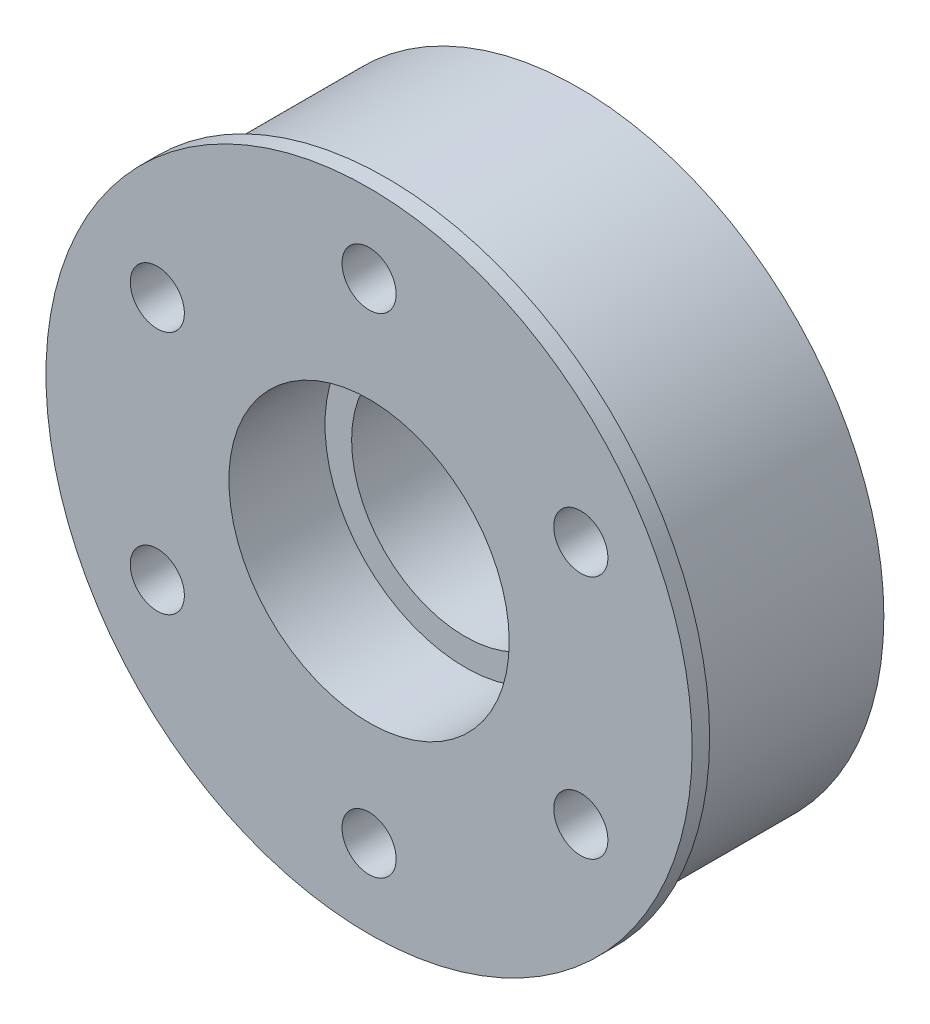
ISO-10303-21;
HEADER;
FILE_DESCRIPTION(('STEP AP214'),'2;1');
FILE_NAME('part.step','',(''),(''),'','','');
FILE_SCHEMA(('AUTOMOTIVE_DESIGN { 1 0 10303 214 1 1 1 1 }'));
ENDSEC;
DATA;
#1=APPLICATION_CONTEXT('core data for automotive mechanical design processes');
#2=APPLICATION_PROTOCOL_DEFINITION('international standard','automotive_design',2000,#1);
#3=PRODUCT_CONTEXT('',#1,'mechanical');
#4=PRODUCT('Part','Part','',(#3));
#5=PRODUCT_RELATED_PRODUCT_CATEGORY('part','',(#4));
#6=PRODUCT_DEFINITION_FORMATION('','',#4);
#7=PRODUCT_DEFINITION_CONTEXT('part definition',#1,'design');
#8=PRODUCT_DEFINITION('design','',#6,#7);
#9=PRODUCT_DEFINITION_SHAPE('','',#8);
#10=(LENGTH_UNIT() NAMED_UNIT(*) SI_UNIT(.MILLI.,.METRE.));
#11=(NAMED_UNIT(*) PLANE_ANGLE_UNIT() SI_UNIT($,.RADIAN.));
#12=(NAMED_UNIT(*) SI_UNIT($,.STERADIAN.) SOLID_ANGLE_UNIT());
#13=UNCERTAINTY_MEASURE_WITH_UNIT(LENGTH_MEASURE(1.E-05),#10,'distance_accuracy_value','');
#14=(GEOMETRIC_REPRESENTATION_CONTEXT(3) GLOBAL_UNCERTAINTY_ASSIGNED_CONTEXT((#13)) GLOBAL_UNIT_ASSIGNED_CONTEXT((#10,
#11,#12)) REPRESENTATION_CONTEXT('',''));
#15=CARTESIAN_POINT('',(0.,0.,0.));
#16=DIRECTION('',(0.,0.,1.));
#17=DIRECTION('',(1.,0.,0.));
#18=AXIS2_PLACEMENT_3D('',#15,#16,#17);
#19=CARTESIAN_POINT('',(0.,0.,34.6981276760882));
#20=DIRECTION('',(0.,0.,-1.));
#21=DIRECTION('',(-1.,0.,0.));
#22=AXIS2_PLACEMENT_3D('',#19,#20,#21);
#23=CYLINDRICAL_SURFACE('',#22,6.5);
#24=CARTESIAN_POINT('',(0.,0.,0.));
#25=DIRECTION('',(0.,0.,-1.));
#26=DIRECTION('',(-1.,0.,0.));
#27=AXIS2_PLACEMENT_3D('',#24,#25,#26);
#28=CIRCLE('',#27,6.5);
#29=CARTESIAN_POINT('',(-6.5,0.,0.));
#30=VERTEX_POINT('',#29);
#31=EDGE_CURVE('E149',#30,#30,#28,.T.);
#32=ORIENTED_EDGE('',*,*,#31,.T.);
#33=EDGE_LOOP('',(#32));
#34=FACE_BOUND('',#33,.T.);
#35=CARTESIAN_POINT('',(0.,0.,6.5));
#36=DIRECTION('',(0.,0.,1.));
#37=DIRECTION('',(1.,0.,0.));
#38=AXIS2_PLACEMENT_3D('',#35,#36,#37);
#39=CIRCLE('',#38,6.5);
#40=CARTESIAN_POINT('',(6.5,0.,6.5));
#41=VERTEX_POINT('',#40);
#42=EDGE_CURVE('E140',#41,#41,#39,.T.);
#43=ORIENTED_EDGE('',*,*,#42,.T.);
#44=EDGE_LOOP('',(#43));
#45=FACE_BOUND('',#44,.T.);
#46=ADVANCED_FACE('F53',(#34,#45),#23,.F.);
#47=CARTESIAN_POINT('',(0.,0.,12.));
#48=DIRECTION('',(0.,0.,-1.));
#49=DIRECTION('',(-1.,0.,0.));
#50=AXIS2_PLACEMENT_3D('',#47,#48,#49);
#51=CYLINDRICAL_SURFACE('',#50,17.475);
#52=CARTESIAN_POINT('',(0.,0.,0.));
#53=DIRECTION('',(0.,0.,1.));
#54=DIRECTION('',(1.,0.,0.));
#55=AXIS2_PLACEMENT_3D('',#52,#53,#54);
#56=CIRCLE('',#55,17.475);
#57=CARTESIAN_POINT('',(17.475,0.,0.));
#58=VERTEX_POINT('',#57);
#59=EDGE_CURVE('E62',#58,#58,#56,.T.);
#60=ORIENTED_EDGE('',*,*,#59,.T.);
#61=EDGE_LOOP('',(#60));
#62=FACE_BOUND('',#61,.T.);
#63=CARTESIAN_POINT('',(0.,0.,11.));
#64=DIRECTION('',(0.,0.,1.));
#65=DIRECTION('',(1.,0.,0.));
#66=AXIS2_PLACEMENT_3D('',#63,#64,#65);
#67=CIRCLE('',#66,17.475);
#68=CARTESIAN_POINT('',(17.475,0.,11.));
#69=VERTEX_POINT('',#68);
#70=EDGE_CURVE('E12',#69,#69,#67,.T.);
#71=ORIENTED_EDGE('',*,*,#70,.F.);
#72=EDGE_LOOP('',(#71));
#73=FACE_BOUND('',#72,.T.);
#74=ADVANCED_FACE('F55',(#62,#73),#51,.T.);
#75=CARTESIAN_POINT('',(0.,0.,12.));
#76=DIRECTION('',(0.,0.,1.));
#77=DIRECTION('',(1.,0.,0.));
#78=AXIS2_PLACEMENT_3D('',#75,#76,#77);
#79=PLANE('',#78);
#80=CARTESIAN_POINT('',(0.,0.,12.));
#81=DIRECTION('',(0.,0.,1.));
#82=DIRECTION('',(1.,0.,0.));
#83=AXIS2_PLACEMENT_3D('',#80,#81,#82);
#84=CIRCLE('',#83,8.025);
#85=CARTESIAN_POINT('',(8.025,0.,12.));
#86=VERTEX_POINT('',#85);
#87=EDGE_CURVE('E144',#86,#86,#84,.T.);
#88=ORIENTED_EDGE('',*,*,#87,.F.);
#89=EDGE_LOOP('',(#88));
#90=FACE_BOUND('',#89,.T.);
#91=CARTESIAN_POINT('',(-12.1243556529805,-7.00000000000096,12.));
#92=DIRECTION('',(0.,0.,1.));
#93=DIRECTION('',(1.,0.,0.));
#94=AXIS2_PLACEMENT_3D('',#91,#92,#93);
#95=CIRCLE('',#94,1.55);
#96=CARTESIAN_POINT('',(-10.5743556529805,-7.00000000000096,12.));
#97=VERTEX_POINT('',#96);
#98=EDGE_CURVE('E161',#97,#97,#95,.T.);
#99=ORIENTED_EDGE('',*,*,#98,.F.);
#100=EDGE_LOOP('',(#99));
#101=FACE_BOUND('',#100,.T.);
#102=CARTESIAN_POINT('',(2.21223967773475E-12,-14.,12.));
#103=DIRECTION('',(0.,0.,1.));
#104=DIRECTION('',(1.,0.,0.));
#105=AXIS2_PLACEMENT_3D('',#102,#103,#104);
#106=CIRCLE('',#105,1.55);
#107=CARTESIAN_POINT('',(1.55000000000221,-14.,12.));
#108=VERTEX_POINT('',#107);
#109=EDGE_CURVE('E194',#108,#108,#106,.T.);
#110=ORIENTED_EDGE('',*,*,#109,.F.);
#111=EDGE_LOOP('',(#110));
#112=FACE_BOUND('',#111,.T.);
#113=CARTESIAN_POINT('',(12.1243556529838,-6.99999999999904,12.));
#114=DIRECTION('',(0.,0.,1.));
#115=DIRECTION('',(1.,0.,0.));
#116=AXIS2_PLACEMENT_3D('',#113,#114,#115);
#117=CIRCLE('',#116,1.55);
#118=CARTESIAN_POINT('',(13.6743556529838,-6.99999999999904,12.));
#119=VERTEX_POINT('',#118);
#120=EDGE_CURVE('E186',#119,#119,#117,.T.);
#121=ORIENTED_EDGE('',*,*,#120,.F.);
#122=EDGE_LOOP('',(#121));
#123=FACE_BOUND('',#122,.T.);
#124=CARTESIAN_POINT('',(12.1243556529827,7.00000000000096,12.));
#125=DIRECTION('',(0.,0.,1.));
#126=DIRECTION('',(1.,0.,0.));
#127=AXIS2_PLACEMENT_3D('',#124,#125,#126);
#128=CIRCLE('',#127,1.55);
#129=CARTESIAN_POINT('',(13.6743556529827,7.00000000000096,12.));
#130=VERTEX_POINT('',#129);
#131=EDGE_CURVE('E178',#130,#130,#128,.T.);
#132=ORIENTED_EDGE('',*,*,#131,.F.);
#133=EDGE_LOOP('',(#132));
#134=FACE_BOUND('',#133,.T.);
#135=CARTESIAN_POINT('',(0.,14.,12.));
#136=DIRECTION('',(0.,0.,1.));
#137=DIRECTION('',(1.,0.,0.));
#138=AXIS2_PLACEMENT_3D('',#135,#136,#137);
#139=CIRCLE('',#138,1.55);
#140=CARTESIAN_POINT('',(1.55,14.,12.));
#141=VERTEX_POINT('',#140);
#142=EDGE_CURVE('E170',#141,#141,#139,.T.);
#143=ORIENTED_EDGE('',*,*,#142,.F.);
#144=EDGE_LOOP('',(#143));
#145=FACE_BOUND('',#144,.T.);
#146=CARTESIAN_POINT('',(-12.1243556529816,6.99999999999903,12.));
#147=DIRECTION('',(0.,0.,1.));
#148=DIRECTION('',(1.,0.,0.));
#149=AXIS2_PLACEMENT_3D('',#146,#147,#148);
#150=CIRCLE('',#149,1.55);
#151=CARTESIAN_POINT('',(-10.5743556529816,6.99999999999903,12.));
#152=VERTEX_POINT('',#151);
#153=EDGE_CURVE('E169',#152,#152,#150,.T.);
#154=ORIENTED_EDGE('',*,*,#153,.F.);
#155=EDGE_LOOP('',(#154));
#156=FACE_BOUND('',#155,.T.);
#157=CARTESIAN_POINT('',(0.,0.,12.));
#158=DIRECTION('',(0.,0.,1.));
#159=DIRECTION('',(1.,0.,0.));
#160=AXIS2_PLACEMENT_3D('',#157,#158,#159);
#161=CIRCLE('',#160,18.5);
#162=CARTESIAN_POINT('',(18.5,0.,12.));
#163=VERTEX_POINT('',#162);
#164=EDGE_CURVE('E156',#163,#163,#161,.T.);
#165=ORIENTED_EDGE('',*,*,#164,.T.);
#166=EDGE_LOOP('',(#165));
#167=FACE_BOUND('',#166,.T.);
#168=ADVANCED_FACE('F223',(#90,#101,#112,#123,#134,#145,#156,#167),#79,.T.);
#169=CARTESIAN_POINT('',(0.,0.,0.));
#170=DIRECTION('',(0.,0.,1.));
#171=DIRECTION('',(1.,0.,0.));
#172=AXIS2_PLACEMENT_3D('',#169,#170,#171);
#173=PLANE('',#172);
#174=CARTESIAN_POINT('',(12.0000000000004,7.72884256350628E-13,0.));
#175=DIRECTION('',(0.,0.,-1.));
#176=DIRECTION('',(-1.,0.,0.));
#177=AXIS2_PLACEMENT_3D('',#174,#175,#176);
#178=CIRCLE('',#177,2.1);
#179=CARTESIAN_POINT('',(9.90000000000045,7.72884256350628E-13,0.));
#180=VERTEX_POINT('',#179);
#181=EDGE_CURVE('E93',#180,#180,#178,.T.);
#182=ORIENTED_EDGE('',*,*,#181,.F.);
#183=EDGE_LOOP('',(#182));
#184=FACE_BOUND('',#183,.T.);
#185=CARTESIAN_POINT('',(6.0000000000009,-10.3923048454128,0.));
#186=DIRECTION('',(0.,0.,-1.));
#187=DIRECTION('',(-1.,0.,0.));
#188=AXIS2_PLACEMENT_3D('',#185,#186,#187);
#189=CIRCLE('',#188,2.1);
#190=CARTESIAN_POINT('',(3.9000000000009,-10.3923048454128,0.));
#191=VERTEX_POINT('',#190);
#192=EDGE_CURVE('E92',#191,#191,#189,.T.);
#193=ORIENTED_EDGE('',*,*,#192,.F.);
#194=EDGE_LOOP('',(#193));
#195=FACE_BOUND('',#194,.T.);
#196=CARTESIAN_POINT('',(-5.99999999999911,-10.3923048454133,0.));
#197=DIRECTION('',(0.,0.,-1.));
#198=DIRECTION('',(-1.,0.,0.));
#199=AXIS2_PLACEMENT_3D('',#196,#197,#198);
#200=CIRCLE('',#199,2.1);
#201=CARTESIAN_POINT('',(-8.09999999999911,-10.3923048454133,0.));
#202=VERTEX_POINT('',#201);
#203=EDGE_CURVE('E108',#202,#202,#200,.T.);
#204=ORIENTED_EDGE('',*,*,#203,.F.);
#205=EDGE_LOOP('',(#204));
#206=FACE_BOUND('',#205,.T.);
#207=CARTESIAN_POINT('',(-6.00000000000002,10.3923048454133,0.));
#208=DIRECTION('',(0.,0.,-1.));
#209=DIRECTION('',(-1.,0.,0.));
#210=AXIS2_PLACEMENT_3D('',#207,#208,#209);
#211=CIRCLE('',#210,2.1);
#212=CARTESIAN_POINT('',(-8.10000000000002,10.3923048454133,0.));
#213=VERTEX_POINT('',#212);
#214=EDGE_CURVE('E116',#213,#213,#211,.T.);
#215=ORIENTED_EDGE('',*,*,#214,.F.);
#216=EDGE_LOOP('',(#215));
#217=FACE_BOUND('',#216,.T.);
#218=CARTESIAN_POINT('',(-11.9999999999996,-2.83692236125169E-13,0.));
#219=DIRECTION('',(0.,0.,-1.));
#220=DIRECTION('',(-1.,0.,0.));
#221=AXIS2_PLACEMENT_3D('',#218,#219,#220);
#222=CIRCLE('',#221,2.1);
#223=CARTESIAN_POINT('',(-14.0999999999996,-2.83692236125169E-13,0.));
#224=VERTEX_POINT('',#223);
#225=EDGE_CURVE('E124',#224,#224,#222,.T.);
#226=ORIENTED_EDGE('',*,*,#225,.F.);
#227=EDGE_LOOP('',(#226));
#228=FACE_BOUND('',#227,.T.);
#229=CARTESIAN_POINT('',(5.99999999999999,10.3923048454138,0.));
#230=DIRECTION('',(0.,0.,-1.));
#231=DIRECTION('',(-1.,0.,0.));
#232=AXIS2_PLACEMENT_3D('',#229,#230,#231);
#233=CIRCLE('',#232,2.1);
#234=CARTESIAN_POINT('',(3.89999999999999,10.3923048454138,0.));
#235=VERTEX_POINT('',#234);
#236=EDGE_CURVE('E132',#235,#235,#233,.T.);
#237=ORIENTED_EDGE('',*,*,#236,.F.);
#238=EDGE_LOOP('',(#237));
#239=FACE_BOUND('',#238,.T.);
#240=ORIENTED_EDGE('',*,*,#59,.F.);
#241=EDGE_LOOP('',(#240));
#242=FACE_BOUND('',#241,.T.);
#243=ORIENTED_EDGE('',*,*,#31,.F.);
#244=EDGE_LOOP('',(#243));
#245=FACE_BOUND('',#244,.T.);
#246=ADVANCED_FACE('F219',(#184,#195,#206,#217,#228,#239,#242,#245),#173,.F.);
#247=CARTESIAN_POINT('',(-12.1243556529816,6.99999999999903,8.));
#248=DIRECTION('',(0.,0.,1.));
#249=DIRECTION('',(1.,0.,0.));
#250=AXIS2_PLACEMENT_3D('',#247,#248,#249);
#251=CYLINDRICAL_SURFACE('',#250,1.55);
#252=CARTESIAN_POINT('',(-12.1243556529816,6.99999999999903,8.));
#253=DIRECTION('',(0.,0.,1.));
#254=DIRECTION('',(1.,0.,0.));
#255=AXIS2_PLACEMENT_3D('',#252,#253,#254);
#256=CIRCLE('',#255,1.55);
#257=CARTESIAN_POINT('',(-10.5743556529816,6.99999999999903,8.));
#258=VERTEX_POINT('',#257);
#259=EDGE_CURVE('E205',#258,#258,#256,.T.);
#260=ORIENTED_EDGE('',*,*,#259,.F.);
#261=EDGE_LOOP('',(#260));
#262=FACE_BOUND('',#261,.T.);
#263=ORIENTED_EDGE('',*,*,#153,.T.);
#264=EDGE_LOOP('',(#263));
#265=FACE_BOUND('',#264,.T.);
#266=ADVANCED_FACE('F222',(#262,#265),#251,.F.);
#267=CARTESIAN_POINT('',(-12.1243556529816,6.99999999999903,8.));
#268=DIRECTION('',(0.,0.,1.));
#269=DIRECTION('',(1.,0.,0.));
#270=AXIS2_PLACEMENT_3D('',#267,#268,#269);
#271=PLANE('',#270);
#272=ORIENTED_EDGE('',*,*,#259,.T.);
#273=EDGE_LOOP('',(#272));
#274=FACE_BOUND('',#273,.T.);
#275=ADVANCED_FACE('F286',(#274),#271,.T.);
#276=CARTESIAN_POINT('',(0.,14.,8.));
#277=DIRECTION('',(0.,0.,1.));
#278=DIRECTION('',(1.,0.,0.));
#279=AXIS2_PLACEMENT_3D('',#276,#277,#278);
#280=CYLINDRICAL_SURFACE('',#279,1.55);
#281=CARTESIAN_POINT('',(0.,14.,8.));
#282=DIRECTION('',(0.,0.,1.));
#283=DIRECTION('',(1.,0.,0.));
#284=AXIS2_PLACEMENT_3D('',#281,#282,#283);
#285=CIRCLE('',#284,1.55);
#286=CARTESIAN_POINT('',(1.55,14.,8.));
#287=VERTEX_POINT('',#286);
#288=EDGE_CURVE('E165',#287,#287,#285,.T.);
#289=ORIENTED_EDGE('',*,*,#288,.F.);
#290=EDGE_LOOP('',(#289));
#291=FACE_BOUND('',#290,.T.);
#292=ORIENTED_EDGE('',*,*,#142,.T.);
#293=EDGE_LOOP('',(#292));
#294=FACE_BOUND('',#293,.T.);
#295=ADVANCED_FACE('F282',(#291,#294),#280,.F.);
#296=CARTESIAN_POINT('',(0.,14.,8.));
#297=DIRECTION('',(0.,0.,1.));
#298=DIRECTION('',(1.,0.,0.));
#299=AXIS2_PLACEMENT_3D('',#296,#297,#298);
#300=PLANE('',#299);
#301=ORIENTED_EDGE('',*,*,#288,.T.);
#302=EDGE_LOOP('',(#301));
#303=FACE_BOUND('',#302,.T.);
#304=ADVANCED_FACE('F278',(#303),#300,.T.);
#305=CARTESIAN_POINT('',(12.1243556529827,7.00000000000096,8.));
#306=DIRECTION('',(0.,0.,1.));
#307=DIRECTION('',(1.,0.,0.));
#308=AXIS2_PLACEMENT_3D('',#305,#306,#307);
#309=CYLINDRICAL_SURFACE('',#308,1.55);
#310=CARTESIAN_POINT('',(12.1243556529827,7.00000000000096,8.));
#311=DIRECTION('',(0.,0.,1.));
#312=DIRECTION('',(1.,0.,0.));
#313=AXIS2_PLACEMENT_3D('',#310,#311,#312);
#314=CIRCLE('',#313,1.55);
#315=CARTESIAN_POINT('',(13.6743556529827,7.00000000000096,8.));
#316=VERTEX_POINT('',#315);
#317=EDGE_CURVE('E174',#316,#316,#314,.T.);
#318=ORIENTED_EDGE('',*,*,#317,.F.);
#319=EDGE_LOOP('',(#318));
#320=FACE_BOUND('',#319,.T.);
#321=ORIENTED_EDGE('',*,*,#131,.T.);
#322=EDGE_LOOP('',(#321));
#323=FACE_BOUND('',#322,.T.);
#324=ADVANCED_FACE('F281',(#320,#323),#309,.F.);
#325=CARTESIAN_POINT('',(12.1243556529827,7.00000000000096,8.));
#326=DIRECTION('',(0.,0.,1.));
#327=DIRECTION('',(1.,0.,0.));
#328=AXIS2_PLACEMENT_3D('',#325,#326,#327);
#329=PLANE('',#328);
#330=ORIENTED_EDGE('',*,*,#317,.T.);
#331=EDGE_LOOP('',(#330));
#332=FACE_BOUND('',#331,.T.);
#333=ADVANCED_FACE('F288',(#332),#329,.T.);
#334=CARTESIAN_POINT('',(12.1243556529838,-6.99999999999904,8.));
#335=DIRECTION('',(0.,0.,1.));
#336=DIRECTION('',(1.,0.,0.));
#337=AXIS2_PLACEMENT_3D('',#334,#335,#336);
#338=CYLINDRICAL_SURFACE('',#337,1.55);
#339=CARTESIAN_POINT('',(12.1243556529838,-6.99999999999904,8.));
#340=DIRECTION('',(0.,0.,1.));
#341=DIRECTION('',(1.,0.,0.));
#342=AXIS2_PLACEMENT_3D('',#339,#340,#341);
#343=CIRCLE('',#342,1.55);
#344=CARTESIAN_POINT('',(13.6743556529838,-6.99999999999904,8.));
#345=VERTEX_POINT('',#344);
#346=EDGE_CURVE('E182',#345,#345,#343,.T.);
#347=ORIENTED_EDGE('',*,*,#346,.F.);
#348=EDGE_LOOP('',(#347));
#349=FACE_BOUND('',#348,.T.);
#350=ORIENTED_EDGE('',*,*,#120,.T.);
#351=EDGE_LOOP('',(#350));
#352=FACE_BOUND('',#351,.T.);
#353=ADVANCED_FACE('F291',(#349,#352),#338,.F.);
#354=CARTESIAN_POINT('',(12.1243556529838,-6.99999999999904,8.));
#355=DIRECTION('',(0.,0.,1.));
#356=DIRECTION('',(1.,0.,0.));
#357=AXIS2_PLACEMENT_3D('',#354,#355,#356);
#358=PLANE('',#357);
#359=ORIENTED_EDGE('',*,*,#346,.T.);
#360=EDGE_LOOP('',(#359));
#361=FACE_BOUND('',#360,.T.);
#362=ADVANCED_FACE('F296',(#361),#358,.T.);
#363=CARTESIAN_POINT('',(2.21223967773475E-12,-14.,8.));
#364=DIRECTION('',(0.,0.,1.));
#365=DIRECTION('',(1.,0.,0.));
#366=AXIS2_PLACEMENT_3D('',#363,#364,#365);
#367=CYLINDRICAL_SURFACE('',#366,1.55);
#368=CARTESIAN_POINT('',(2.21223967773475E-12,-14.,8.));
#369=DIRECTION('',(0.,0.,1.));
#370=DIRECTION('',(1.,0.,0.));
#371=AXIS2_PLACEMENT_3D('',#368,#369,#370);
#372=CIRCLE('',#371,1.55);
#373=CARTESIAN_POINT('',(1.55000000000221,-14.,8.));
#374=VERTEX_POINT('',#373);
#375=EDGE_CURVE('E190',#374,#374,#372,.T.);
#376=ORIENTED_EDGE('',*,*,#375,.F.);
#377=EDGE_LOOP('',(#376));
#378=FACE_BOUND('',#377,.T.);
#379=ORIENTED_EDGE('',*,*,#109,.T.);
#380=EDGE_LOOP('',(#379));
#381=FACE_BOUND('',#380,.T.);
#382=ADVANCED_FACE('F299',(#378,#381),#367,.F.);
#383=CARTESIAN_POINT('',(2.21223967773475E-12,-14.,8.));
#384=DIRECTION('',(0.,0.,1.));
#385=DIRECTION('',(1.,0.,0.));
#386=AXIS2_PLACEMENT_3D('',#383,#384,#385);
#387=PLANE('',#386);
#388=ORIENTED_EDGE('',*,*,#375,.T.);
#389=EDGE_LOOP('',(#388));
#390=FACE_BOUND('',#389,.T.);
#391=ADVANCED_FACE('F304',(#390),#387,.T.);
#392=CARTESIAN_POINT('',(-12.1243556529805,-7.00000000000096,8.));
#393=DIRECTION('',(0.,0.,1.));
#394=DIRECTION('',(1.,0.,0.));
#395=AXIS2_PLACEMENT_3D('',#392,#393,#394);
#396=CYLINDRICAL_SURFACE('',#395,1.55);
#397=CARTESIAN_POINT('',(-12.1243556529805,-7.00000000000096,8.));
#398=DIRECTION('',(0.,0.,1.));
#399=DIRECTION('',(1.,0.,0.));
#400=AXIS2_PLACEMENT_3D('',#397,#398,#399);
#401=CIRCLE('',#400,1.55);
#402=CARTESIAN_POINT('',(-10.5743556529805,-7.00000000000096,8.));
#403=VERTEX_POINT('',#402);
#404=EDGE_CURVE('E198',#403,#403,#401,.T.);
#405=ORIENTED_EDGE('',*,*,#404,.F.);
#406=EDGE_LOOP('',(#405));
#407=FACE_BOUND('',#406,.T.);
#408=ORIENTED_EDGE('',*,*,#98,.T.);
#409=EDGE_LOOP('',(#408));
#410=FACE_BOUND('',#409,.T.);
#411=ADVANCED_FACE('F274',(#407,#410),#396,.F.);
#412=CARTESIAN_POINT('',(-12.1243556529805,-7.00000000000096,8.));
#413=DIRECTION('',(0.,0.,1.));
#414=DIRECTION('',(1.,0.,0.));
#415=AXIS2_PLACEMENT_3D('',#412,#413,#414);
#416=PLANE('',#415);
#417=ORIENTED_EDGE('',*,*,#404,.T.);
#418=EDGE_LOOP('',(#417));
#419=FACE_BOUND('',#418,.T.);
#420=ADVANCED_FACE('F265',(#419),#416,.T.);
#421=CARTESIAN_POINT('',(0.,0.,11.));
#422=DIRECTION('',(0.,0.,1.));
#423=DIRECTION('',(1.,0.,0.));
#424=AXIS2_PLACEMENT_3D('',#421,#422,#423);
#425=CYLINDRICAL_SURFACE('',#424,18.5);
#426=CARTESIAN_POINT('',(0.,0.,11.));
#427=DIRECTION('',(0.,0.,1.));
#428=DIRECTION('',(1.,0.,0.));
#429=AXIS2_PLACEMENT_3D('',#426,#427,#428);
#430=CIRCLE('',#429,18.5);
#431=CARTESIAN_POINT('',(18.5,0.,11.));
#432=VERTEX_POINT('',#431);
#433=EDGE_CURVE('E157',#432,#432,#430,.T.);
#434=ORIENTED_EDGE('',*,*,#433,.T.);
#435=EDGE_LOOP('',(#434));
#436=FACE_BOUND('',#435,.T.);
#437=ORIENTED_EDGE('',*,*,#164,.F.);
#438=EDGE_LOOP('',(#437));
#439=FACE_BOUND('',#438,.T.);
#440=ADVANCED_FACE('F263',(#436,#439),#425,.T.);
#441=CARTESIAN_POINT('',(0.,0.,11.));
#442=DIRECTION('',(0.,0.,1.));
#443=DIRECTION('',(1.,0.,0.));
#444=AXIS2_PLACEMENT_3D('',#441,#442,#443);
#445=PLANE('',#444);
#446=ORIENTED_EDGE('',*,*,#70,.T.);
#447=EDGE_LOOP('',(#446));
#448=FACE_BOUND('',#447,.T.);
#449=ORIENTED_EDGE('',*,*,#433,.F.);
#450=EDGE_LOOP('',(#449));
#451=FACE_BOUND('',#450,.T.);
#452=ADVANCED_FACE('F242',(#448,#451),#445,.F.);
#453=CARTESIAN_POINT('',(0.,0.,6.5));
#454=DIRECTION('',(0.,0.,1.));
#455=DIRECTION('',(1.,0.,0.));
#456=AXIS2_PLACEMENT_3D('',#453,#454,#455);
#457=CYLINDRICAL_SURFACE('',#456,8.025);
#458=CARTESIAN_POINT('',(0.,0.,6.5));
#459=DIRECTION('',(0.,0.,1.));
#460=DIRECTION('',(1.,0.,0.));
#461=AXIS2_PLACEMENT_3D('',#458,#459,#460);
#462=CIRCLE('',#461,8.025);
#463=CARTESIAN_POINT('',(8.025,0.,6.5));
#464=VERTEX_POINT('',#463);
#465=EDGE_CURVE('E145',#464,#464,#462,.T.);
#466=ORIENTED_EDGE('',*,*,#465,.F.);
#467=EDGE_LOOP('',(#466));
#468=FACE_BOUND('',#467,.T.);
#469=ORIENTED_EDGE('',*,*,#87,.T.);
#470=EDGE_LOOP('',(#469));
#471=FACE_BOUND('',#470,.T.);
#472=ADVANCED_FACE('F236',(#468,#471),#457,.F.);
#473=CARTESIAN_POINT('',(0.,0.,6.5));
#474=DIRECTION('',(0.,0.,1.));
#475=DIRECTION('',(1.,0.,0.));
#476=AXIS2_PLACEMENT_3D('',#473,#474,#475);
#477=PLANE('',#476);
#478=ORIENTED_EDGE('',*,*,#42,.F.);
#479=EDGE_LOOP('',(#478));
#480=FACE_BOUND('',#479,.T.);
#481=ORIENTED_EDGE('',*,*,#465,.T.);
#482=EDGE_LOOP('',(#481));
#483=FACE_BOUND('',#482,.T.);
#484=ADVANCED_FACE('F232',(#480,#483),#477,.T.);
#485=CARTESIAN_POINT('',(5.99999999999999,10.3923048454138,8.));
#486=DIRECTION('',(0.,0.,-1.));
#487=DIRECTION('',(-1.,0.,0.));
#488=AXIS2_PLACEMENT_3D('',#485,#486,#487);
#489=CONICAL_SURFACE('',#488,2.1,1.02974425867665);
#490=CARTESIAN_POINT('',(5.99999999999999,10.3923048454138,9.26180729995788));
#491=VERTEX_POINT('',#490);
#492=VERTEX_LOOP('',#491);
#493=FACE_BOUND('',#492,.T.);
#494=CARTESIAN_POINT('',(5.99999999999999,10.3923048454138,8.));
#495=DIRECTION('',(0.,0.,-1.));
#496=DIRECTION('',(-1.,0.,0.));
#497=AXIS2_PLACEMENT_3D('',#494,#495,#496);
#498=CIRCLE('',#497,2.1);
#499=CARTESIAN_POINT('',(3.89999999999999,10.3923048454138,8.));
#500=VERTEX_POINT('',#499);
#501=EDGE_CURVE('E136',#500,#500,#498,.T.);
#502=ORIENTED_EDGE('',*,*,#501,.T.);
#503=EDGE_LOOP('',(#502));
#504=FACE_BOUND('',#503,.T.);
#505=ADVANCED_FACE('F235',(#493,#504),#489,.F.);
#506=CARTESIAN_POINT('',(5.99999999999999,10.3923048454138,0.));
#507=DIRECTION('',(0.,0.,-1.));
#508=DIRECTION('',(-1.,0.,0.));
#509=AXIS2_PLACEMENT_3D('',#506,#507,#508);
#510=CYLINDRICAL_SURFACE('',#509,2.1);
#511=ORIENTED_EDGE('',*,*,#501,.F.);
#512=EDGE_LOOP('',(#511));
#513=FACE_BOUND('',#512,.T.);
#514=ORIENTED_EDGE('',*,*,#236,.T.);
#515=EDGE_LOOP('',(#514));
#516=FACE_BOUND('',#515,.T.);
#517=ADVANCED_FACE('F404',(#513,#516),#510,.F.);
#518=CARTESIAN_POINT('',(-11.9999999999996,-2.83692236125169E-13,8.));
#519=DIRECTION('',(0.,0.,-1.));
#520=DIRECTION('',(-1.,0.,0.));
#521=AXIS2_PLACEMENT_3D('',#518,#519,#520);
#522=CONICAL_SURFACE('',#521,2.1,1.02974425867665);
#523=CARTESIAN_POINT('',(-11.9999999999996,-2.83692236125169E-13,9.26180729995788));
#524=VERTEX_POINT('',#523);
#525=VERTEX_LOOP('',#524);
#526=FACE_BOUND('',#525,.T.);
#527=CARTESIAN_POINT('',(-11.9999999999996,-2.83692236125169E-13,8.));
#528=DIRECTION('',(0.,0.,-1.));
#529=DIRECTION('',(-1.,0.,0.));
#530=AXIS2_PLACEMENT_3D('',#527,#528,#529);
#531=CIRCLE('',#530,2.1);
#532=CARTESIAN_POINT('',(-14.0999999999996,-2.83692236125169E-13,8.));
#533=VERTEX_POINT('',#532);
#534=EDGE_CURVE('E128',#533,#533,#531,.T.);
#535=ORIENTED_EDGE('',*,*,#534,.T.);
#536=EDGE_LOOP('',(#535));
#537=FACE_BOUND('',#536,.T.);
#538=ADVANCED_FACE('F414',(#526,#537),#522,.F.);
#539=CARTESIAN_POINT('',(-11.9999999999996,-2.83692236125169E-13,0.));
#540=DIRECTION('',(0.,0.,-1.));
#541=DIRECTION('',(-1.,0.,0.));
#542=AXIS2_PLACEMENT_3D('',#539,#540,#541);
#543=CYLINDRICAL_SURFACE('',#542,2.1);
#544=ORIENTED_EDGE('',*,*,#534,.F.);
#545=EDGE_LOOP('',(#544));
#546=FACE_BOUND('',#545,.T.);
#547=ORIENTED_EDGE('',*,*,#225,.T.);
#548=EDGE_LOOP('',(#547));
#549=FACE_BOUND('',#548,.T.);
#550=ADVANCED_FACE('F424',(#546,#549),#543,.F.);
#551=CARTESIAN_POINT('',(-6.00000000000002,10.3923048454133,8.));
#552=DIRECTION('',(0.,0.,-1.));
#553=DIRECTION('',(-1.,0.,0.));
#554=AXIS2_PLACEMENT_3D('',#551,#552,#553);
#555=CONICAL_SURFACE('',#554,2.1,1.02974425867665);
#556=CARTESIAN_POINT('',(-6.00000000000002,10.3923048454133,9.26180729995788));
#557=VERTEX_POINT('',#556);
#558=VERTEX_LOOP('',#557);
#559=FACE_BOUND('',#558,.T.);
#560=CARTESIAN_POINT('',(-6.00000000000002,10.3923048454133,8.));
#561=DIRECTION('',(0.,0.,-1.));
#562=DIRECTION('',(-1.,0.,0.));
#563=AXIS2_PLACEMENT_3D('',#560,#561,#562);
#564=CIRCLE('',#563,2.1);
#565=CARTESIAN_POINT('',(-8.10000000000001,10.3923048454133,8.));
#566=VERTEX_POINT('',#565);
#567=EDGE_CURVE('E120',#566,#566,#564,.T.);
#568=ORIENTED_EDGE('',*,*,#567,.T.);
#569=EDGE_LOOP('',(#568));
#570=FACE_BOUND('',#569,.T.);
#571=ADVANCED_FACE('F433',(#559,#570),#555,.F.);
#572=CARTESIAN_POINT('',(-6.00000000000002,10.3923048454133,0.));
#573=DIRECTION('',(0.,0.,-1.));
#574=DIRECTION('',(-1.,0.,0.));
#575=AXIS2_PLACEMENT_3D('',#572,#573,#574);
#576=CYLINDRICAL_SURFACE('',#575,2.1);
#577=ORIENTED_EDGE('',*,*,#567,.F.);
#578=EDGE_LOOP('',(#577));
#579=FACE_BOUND('',#578,.T.);
#580=ORIENTED_EDGE('',*,*,#214,.T.);
#581=EDGE_LOOP('',(#580));
#582=FACE_BOUND('',#581,.T.);
#583=ADVANCED_FACE('F443',(#579,#582),#576,.F.);
#584=CARTESIAN_POINT('',(-5.99999999999911,-10.3923048454133,8.));
#585=DIRECTION('',(0.,0.,-1.));
#586=DIRECTION('',(-1.,0.,0.));
#587=AXIS2_PLACEMENT_3D('',#584,#585,#586);
#588=CONICAL_SURFACE('',#587,2.1,1.02974425867665);
#589=CARTESIAN_POINT('',(-5.99999999999911,-10.3923048454133,9.26180729995788));
#590=VERTEX_POINT('',#589);
#591=VERTEX_LOOP('',#590);
#592=FACE_BOUND('',#591,.T.);
#593=CARTESIAN_POINT('',(-5.99999999999911,-10.3923048454133,8.));
#594=DIRECTION('',(0.,0.,-1.));
#595=DIRECTION('',(-1.,0.,0.));
#596=AXIS2_PLACEMENT_3D('',#593,#594,#595);
#597=CIRCLE('',#596,2.1);
#598=CARTESIAN_POINT('',(-8.09999999999911,-10.3923048454133,8.));
#599=VERTEX_POINT('',#598);
#600=EDGE_CURVE('E112',#599,#599,#597,.T.);
#601=ORIENTED_EDGE('',*,*,#600,.T.);
#602=EDGE_LOOP('',(#601));
#603=FACE_BOUND('',#602,.T.);
#604=ADVANCED_FACE('F453',(#592,#603),#588,.F.);
#605=CARTESIAN_POINT('',(-5.99999999999911,-10.3923048454133,0.));
#606=DIRECTION('',(0.,0.,-1.));
#607=DIRECTION('',(-1.,0.,0.));
#608=AXIS2_PLACEMENT_3D('',#605,#606,#607);
#609=CYLINDRICAL_SURFACE('',#608,2.1);
#610=ORIENTED_EDGE('',*,*,#600,.F.);
#611=EDGE_LOOP('',(#610));
#612=FACE_BOUND('',#611,.T.);
#613=ORIENTED_EDGE('',*,*,#203,.T.);
#614=EDGE_LOOP('',(#613));
#615=FACE_BOUND('',#614,.T.);
#616=ADVANCED_FACE('F463',(#612,#615),#609,.F.);
#617=CARTESIAN_POINT('',(6.0000000000009,-10.3923048454128,8.));
#618=DIRECTION('',(0.,0.,-1.));
#619=DIRECTION('',(-1.,0.,0.));
#620=AXIS2_PLACEMENT_3D('',#617,#618,#619);
#621=CONICAL_SURFACE('',#620,2.1,1.02974425867665);
#622=CARTESIAN_POINT('',(6.00000000000089,-10.3923048454128,9.26180729995788));
#623=VERTEX_POINT('',#622);
#624=VERTEX_LOOP('',#623);
#625=FACE_BOUND('',#624,.T.);
#626=CARTESIAN_POINT('',(6.0000000000009,-10.3923048454128,8.));
#627=DIRECTION('',(0.,0.,-1.));
#628=DIRECTION('',(-1.,0.,0.));
#629=AXIS2_PLACEMENT_3D('',#626,#627,#628);
#630=CIRCLE('',#629,2.1);
#631=CARTESIAN_POINT('',(3.9000000000009,-10.3923048454128,8.));
#632=VERTEX_POINT('',#631);
#633=EDGE_CURVE('E100',#632,#632,#630,.T.);
#634=ORIENTED_EDGE('',*,*,#633,.T.);
#635=EDGE_LOOP('',(#634));
#636=FACE_BOUND('',#635,.T.);
#637=ADVANCED_FACE('F473',(#625,#636),#621,.F.);
#638=CARTESIAN_POINT('',(6.0000000000009,-10.3923048454128,0.));
#639=DIRECTION('',(0.,0.,-1.));
#640=DIRECTION('',(-1.,0.,0.));
#641=AXIS2_PLACEMENT_3D('',#638,#639,#640);
#642=CYLINDRICAL_SURFACE('',#641,2.1);
#643=ORIENTED_EDGE('',*,*,#633,.F.);
#644=EDGE_LOOP('',(#643));
#645=FACE_BOUND('',#644,.T.);
#646=ORIENTED_EDGE('',*,*,#192,.T.);
#647=EDGE_LOOP('',(#646));
#648=FACE_BOUND('',#647,.T.);
#649=ADVANCED_FACE('F85',(#645,#648),#642,.F.);
#650=CARTESIAN_POINT('',(12.0000000000004,7.72884256350628E-13,8.));
#651=DIRECTION('',(0.,0.,-1.));
#652=DIRECTION('',(-1.,0.,0.));
#653=AXIS2_PLACEMENT_3D('',#650,#651,#652);
#654=CONICAL_SURFACE('',#653,2.1,1.02974425867665);
#655=CARTESIAN_POINT('',(12.0000000000004,7.72884256350628E-13,9.26180729995788));
#656=VERTEX_POINT('',#655);
#657=VERTEX_LOOP('',#656);
#658=FACE_BOUND('',#657,.T.);
#659=CARTESIAN_POINT('',(12.0000000000004,7.72884256350628E-13,8.));
#660=DIRECTION('',(0.,0.,-1.));
#661=DIRECTION('',(-1.,0.,0.));
#662=AXIS2_PLACEMENT_3D('',#659,#660,#661);
#663=CIRCLE('',#662,2.1);
#664=CARTESIAN_POINT('',(9.90000000000045,7.72884256350628E-13,8.));
#665=VERTEX_POINT('',#664);
#666=EDGE_CURVE('E89',#665,#665,#663,.T.);
#667=ORIENTED_EDGE('',*,*,#666,.T.);
#668=EDGE_LOOP('',(#667));
#669=FACE_BOUND('',#668,.T.);
#670=ADVANCED_FACE('F81',(#658,#669),#654,.F.);
#671=CARTESIAN_POINT('',(12.0000000000004,7.72884256350628E-13,0.));
#672=DIRECTION('',(0.,0.,-1.));
#673=DIRECTION('',(-1.,0.,0.));
#674=AXIS2_PLACEMENT_3D('',#671,#672,#673);
#675=CYLINDRICAL_SURFACE('',#674,2.1);
#676=ORIENTED_EDGE('',*,*,#666,.F.);
#677=EDGE_LOOP('',(#676));
#678=FACE_BOUND('',#677,.T.);
#679=ORIENTED_EDGE('',*,*,#181,.T.);
#680=EDGE_LOOP('',(#679));
#681=FACE_BOUND('',#680,.T.);
#682=ADVANCED_FACE('F84',(#678,#681),#675,.F.);
#683=CLOSED_SHELL('',(#46,#74,#168,#246,#266,#275,#295,#304,#324,#333,#353,#362,#382,#391,#411,
#420,#440,#452,#472,#484,#505,#517,#538,#550,#571,#583,#604,#616,#637,#649,#670,#682));
#684=MANIFOLD_SOLID_BREP('B2',#683);
#685=ADVANCED_BREP_SHAPE_REPRESENTATION('',(#18,#684),#14);
#686=SHAPE_DEFINITION_REPRESENTATION(#9,#685);
ENDSEC;
END-ISO-10303-21;
